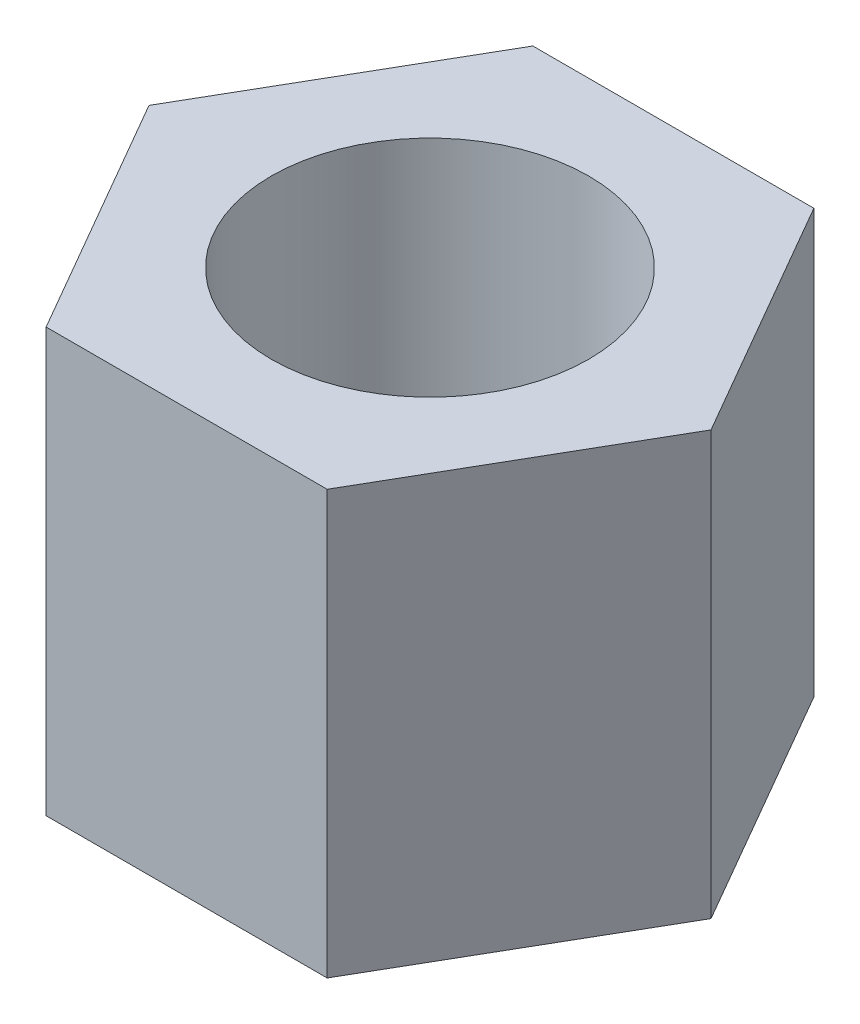
ISO-10303-21;
HEADER;
FILE_DESCRIPTION(('STEP AP214'),'2;1');
FILE_NAME('part.step','',(''),(''),'','','');
FILE_SCHEMA(('AUTOMOTIVE_DESIGN { 1 0 10303 214 1 1 1 1 }'));
ENDSEC;
DATA;
#1=APPLICATION_CONTEXT('core data for automotive mechanical design processes');
#2=APPLICATION_PROTOCOL_DEFINITION('international standard','automotive_design',2000,#1);
#3=PRODUCT_CONTEXT('',#1,'mechanical');
#4=PRODUCT('Part','Part','',(#3));
#5=PRODUCT_RELATED_PRODUCT_CATEGORY('part','',(#4));
#6=PRODUCT_DEFINITION_FORMATION('','',#4);
#7=PRODUCT_DEFINITION_CONTEXT('part definition',#1,'design');
#8=PRODUCT_DEFINITION('design','',#6,#7);
#9=PRODUCT_DEFINITION_SHAPE('','',#8);
#10=(LENGTH_UNIT() NAMED_UNIT(*) SI_UNIT(.MILLI.,.METRE.));
#11=(NAMED_UNIT(*) PLANE_ANGLE_UNIT() SI_UNIT($,.RADIAN.));
#12=(NAMED_UNIT(*) SI_UNIT($,.STERADIAN.) SOLID_ANGLE_UNIT());
#13=UNCERTAINTY_MEASURE_WITH_UNIT(LENGTH_MEASURE(1.E-05),#10,'distance_accuracy_value','');
#14=(GEOMETRIC_REPRESENTATION_CONTEXT(3) GLOBAL_UNCERTAINTY_ASSIGNED_CONTEXT((#13)) GLOBAL_UNIT_ASSIGNED_CONTEXT((#10,
#11,#12)) REPRESENTATION_CONTEXT('',''));
#15=CARTESIAN_POINT('',(0.,0.,0.));
#16=DIRECTION('',(0.,0.,1.));
#17=DIRECTION('',(1.,0.,0.));
#18=AXIS2_PLACEMENT_3D('',#15,#16,#17);
#19=CARTESIAN_POINT('',(1.32790561913614,4.,-2.3));
#20=DIRECTION('',(0.,0.,1.));
#21=DIRECTION('',(1.,0.,0.));
#22=AXIS2_PLACEMENT_3D('',#19,#20,#21);
#23=PLANE('',#22);
#24=DIRECTION('',(-1.,0.,0.));
#25=VECTOR('',#24,1.);
#26=CARTESIAN_POINT('',(1.32790561913614,0.,-2.3));
#27=LINE('',#26,#25);
#28=CARTESIAN_POINT('',(1.32790561913614,0.,-2.3));
#29=VERTEX_POINT('',#28);
#30=CARTESIAN_POINT('',(-1.32790561913614,0.,-2.3));
#31=VERTEX_POINT('',#30);
#32=EDGE_CURVE('E131',#29,#31,#27,.T.);
#33=ORIENTED_EDGE('',*,*,#32,.T.);
#34=DIRECTION('',(0.,-1.,0.));
#35=VECTOR('',#34,1.);
#36=CARTESIAN_POINT('',(-1.32790561913614,4.,-2.3));
#37=LINE('',#36,#35);
#38=CARTESIAN_POINT('',(-1.32790561913614,4.,-2.3));
#39=VERTEX_POINT('',#38);
#40=EDGE_CURVE('E11',#39,#31,#37,.T.);
#41=ORIENTED_EDGE('',*,*,#40,.F.);
#42=DIRECTION('',(-1.,0.,0.));
#43=VECTOR('',#42,1.);
#44=CARTESIAN_POINT('',(1.32790561913614,4.,-2.3));
#45=LINE('',#44,#43);
#46=CARTESIAN_POINT('',(1.32790561913614,4.,-2.3));
#47=VERTEX_POINT('',#46);
#48=EDGE_CURVE('E142',#47,#39,#45,.T.);
#49=ORIENTED_EDGE('',*,*,#48,.F.);
#50=DIRECTION('',(0.,-1.,0.));
#51=VECTOR('',#50,1.);
#52=CARTESIAN_POINT('',(1.32790561913614,4.,-2.3));
#53=LINE('',#52,#51);
#54=EDGE_CURVE('E127',#47,#29,#53,.T.);
#55=ORIENTED_EDGE('',*,*,#54,.T.);
#56=EDGE_LOOP('',(#33,#41,#49,#55));
#57=FACE_BOUND('',#56,.T.);
#58=ADVANCED_FACE('F47',(#57),#23,.F.);
#59=CARTESIAN_POINT('',(-1.32790561913614,4.,-2.3));
#60=DIRECTION('',(0.866025403784439,0.,0.499999999999999));
#61=DIRECTION('',(0.499999999999999,0.,-0.866025403784439));
#62=AXIS2_PLACEMENT_3D('',#59,#60,#61);
#63=PLANE('',#62);
#64=DIRECTION('',(-0.5,0.,0.866025403784439));
#65=VECTOR('',#64,1.);
#66=CARTESIAN_POINT('',(-1.32790561913614,0.,-2.3));
#67=LINE('',#66,#65);
#68=CARTESIAN_POINT('',(-2.65581123827228,0.,0.));
#69=VERTEX_POINT('',#68);
#70=EDGE_CURVE('E134',#31,#69,#67,.T.);
#71=ORIENTED_EDGE('',*,*,#70,.T.);
#72=DIRECTION('',(0.,-1.,0.));
#73=VECTOR('',#72,1.);
#74=CARTESIAN_POINT('',(-2.65581123827228,4.,0.));
#75=LINE('',#74,#73);
#76=CARTESIAN_POINT('',(-2.65581123827228,4.,0.));
#77=VERTEX_POINT('',#76);
#78=EDGE_CURVE('E55',#77,#69,#75,.T.);
#79=ORIENTED_EDGE('',*,*,#78,.F.);
#80=DIRECTION('',(-0.5,0.,0.866025403784439));
#81=VECTOR('',#80,1.);
#82=CARTESIAN_POINT('',(-1.32790561913614,4.,-2.3));
#83=LINE('',#82,#81);
#84=EDGE_CURVE('E100',#39,#77,#83,.T.);
#85=ORIENTED_EDGE('',*,*,#84,.F.);
#86=ORIENTED_EDGE('',*,*,#40,.T.);
#87=EDGE_LOOP('',(#71,#79,#85,#86));
#88=FACE_BOUND('',#87,.T.);
#89=ADVANCED_FACE('F167',(#88),#63,.F.);
#90=CARTESIAN_POINT('',(-2.65581123827228,4.,0.));
#91=DIRECTION('',(0.866025403784438,0.,-0.5));
#92=DIRECTION('',(-0.5,0.,-0.866025403784439));
#93=AXIS2_PLACEMENT_3D('',#90,#91,#92);
#94=PLANE('',#93);
#95=DIRECTION('',(0.5,0.,0.866025403784438));
#96=VECTOR('',#95,1.);
#97=CARTESIAN_POINT('',(-2.65581123827228,0.,0.));
#98=LINE('',#97,#96);
#99=CARTESIAN_POINT('',(-1.32790561913614,0.,2.3));
#100=VERTEX_POINT('',#99);
#101=EDGE_CURVE('E137',#69,#100,#98,.T.);
#102=ORIENTED_EDGE('',*,*,#101,.T.);
#103=DIRECTION('',(0.,-1.,0.));
#104=VECTOR('',#103,1.);
#105=CARTESIAN_POINT('',(-1.32790561913614,4.,2.3));
#106=LINE('',#105,#104);
#107=CARTESIAN_POINT('',(-1.32790561913614,4.,2.3));
#108=VERTEX_POINT('',#107);
#109=EDGE_CURVE('E122',#108,#100,#106,.T.);
#110=ORIENTED_EDGE('',*,*,#109,.F.);
#111=DIRECTION('',(0.5,0.,0.866025403784438));
#112=VECTOR('',#111,1.);
#113=CARTESIAN_POINT('',(-2.65581123827228,4.,0.));
#114=LINE('',#113,#112);
#115=EDGE_CURVE('E113',#77,#108,#114,.T.);
#116=ORIENTED_EDGE('',*,*,#115,.F.);
#117=ORIENTED_EDGE('',*,*,#78,.T.);
#118=EDGE_LOOP('',(#102,#110,#116,#117));
#119=FACE_BOUND('',#118,.T.);
#120=ADVANCED_FACE('F148',(#119),#94,.F.);
#121=CARTESIAN_POINT('',(-1.32790561913614,4.,2.3));
#122=DIRECTION('',(0.,0.,-1.));
#123=DIRECTION('',(-1.,0.,0.));
#124=AXIS2_PLACEMENT_3D('',#121,#122,#123);
#125=PLANE('',#124);
#126=DIRECTION('',(1.,0.,0.));
#127=VECTOR('',#126,1.);
#128=CARTESIAN_POINT('',(-1.32790561913614,0.,2.3));
#129=LINE('',#128,#127);
#130=CARTESIAN_POINT('',(1.32790561913614,0.,2.3));
#131=VERTEX_POINT('',#130);
#132=EDGE_CURVE('E121',#100,#131,#129,.T.);
#133=ORIENTED_EDGE('',*,*,#132,.T.);
#134=DIRECTION('',(0.,-1.,0.));
#135=VECTOR('',#134,1.);
#136=CARTESIAN_POINT('',(1.32790561913614,4.,2.3));
#137=LINE('',#136,#135);
#138=CARTESIAN_POINT('',(1.32790561913614,4.,2.3));
#139=VERTEX_POINT('',#138);
#140=EDGE_CURVE('E118',#139,#131,#137,.T.);
#141=ORIENTED_EDGE('',*,*,#140,.F.);
#142=DIRECTION('',(1.,0.,0.));
#143=VECTOR('',#142,1.);
#144=CARTESIAN_POINT('',(-1.32790561913614,4.,2.3));
#145=LINE('',#144,#143);
#146=EDGE_CURVE('E107',#108,#139,#145,.T.);
#147=ORIENTED_EDGE('',*,*,#146,.F.);
#148=ORIENTED_EDGE('',*,*,#109,.T.);
#149=EDGE_LOOP('',(#133,#141,#147,#148));
#150=FACE_BOUND('',#149,.T.);
#151=ADVANCED_FACE('F119',(#150),#125,.F.);
#152=CARTESIAN_POINT('',(1.32790561913614,4.,2.3));
#153=DIRECTION('',(-0.866025403784439,0.,-0.5));
#154=DIRECTION('',(-0.5,0.,0.866025403784439));
#155=AXIS2_PLACEMENT_3D('',#152,#153,#154);
#156=PLANE('',#155);
#157=DIRECTION('',(0.5,0.,-0.866025403784439));
#158=VECTOR('',#157,1.);
#159=CARTESIAN_POINT('',(1.32790561913614,0.,2.3));
#160=LINE('',#159,#158);
#161=CARTESIAN_POINT('',(2.65581123827228,0.,0.));
#162=VERTEX_POINT('',#161);
#163=EDGE_CURVE('E86',#131,#162,#160,.T.);
#164=ORIENTED_EDGE('',*,*,#163,.T.);
#165=DIRECTION('',(0.,-1.,0.));
#166=VECTOR('',#165,1.);
#167=CARTESIAN_POINT('',(2.65581123827228,4.,0.));
#168=LINE('',#167,#166);
#169=CARTESIAN_POINT('',(2.65581123827228,4.,0.));
#170=VERTEX_POINT('',#169);
#171=EDGE_CURVE('E123',#170,#162,#168,.T.);
#172=ORIENTED_EDGE('',*,*,#171,.F.);
#173=DIRECTION('',(0.5,0.,-0.866025403784439));
#174=VECTOR('',#173,1.);
#175=CARTESIAN_POINT('',(1.32790561913614,4.,2.3));
#176=LINE('',#175,#174);
#177=EDGE_CURVE('E111',#139,#170,#176,.T.);
#178=ORIENTED_EDGE('',*,*,#177,.F.);
#179=ORIENTED_EDGE('',*,*,#140,.T.);
#180=EDGE_LOOP('',(#164,#172,#178,#179));
#181=FACE_BOUND('',#180,.T.);
#182=ADVANCED_FACE('F125',(#181),#156,.F.);
#183=CARTESIAN_POINT('',(2.65581123827228,4.,0.));
#184=DIRECTION('',(-0.866025403784438,0.,0.5));
#185=DIRECTION('',(0.5,0.,0.866025403784438));
#186=AXIS2_PLACEMENT_3D('',#183,#184,#185);
#187=PLANE('',#186);
#188=DIRECTION('',(-0.5,0.,-0.866025403784438));
#189=VECTOR('',#188,1.);
#190=CARTESIAN_POINT('',(2.65581123827228,0.,0.));
#191=LINE('',#190,#189);
#192=EDGE_CURVE('E92',#162,#29,#191,.T.);
#193=ORIENTED_EDGE('',*,*,#192,.T.);
#194=ORIENTED_EDGE('',*,*,#54,.F.);
#195=DIRECTION('',(-0.5,0.,-0.866025403784438));
#196=VECTOR('',#195,1.);
#197=CARTESIAN_POINT('',(2.65581123827228,4.,0.));
#198=LINE('',#197,#196);
#199=EDGE_CURVE('E63',#170,#47,#198,.T.);
#200=ORIENTED_EDGE('',*,*,#199,.F.);
#201=ORIENTED_EDGE('',*,*,#171,.T.);
#202=EDGE_LOOP('',(#193,#194,#200,#201));
#203=FACE_BOUND('',#202,.T.);
#204=ADVANCED_FACE('F155',(#203),#187,.F.);
#205=CARTESIAN_POINT('',(0.,4.,0.));
#206=DIRECTION('',(0.,1.,0.));
#207=DIRECTION('',(0.,0.,1.));
#208=AXIS2_PLACEMENT_3D('',#205,#206,#207);
#209=PLANE('',#208);
#210=CARTESIAN_POINT('',(0.,4.,0.));
#211=DIRECTION('',(0.,1.,0.));
#212=DIRECTION('',(0.,0.,1.));
#213=AXIS2_PLACEMENT_3D('',#210,#211,#212);
#214=CIRCLE('',#213,1.5);
#215=CARTESIAN_POINT('',(0.,4.,1.5));
#216=VERTEX_POINT('',#215);
#217=EDGE_CURVE('E135',#216,#216,#214,.F.);
#218=ORIENTED_EDGE('',*,*,#217,.T.);
#219=EDGE_LOOP('',(#218));
#220=FACE_BOUND('',#219,.T.);
#221=ORIENTED_EDGE('',*,*,#48,.T.);
#222=ORIENTED_EDGE('',*,*,#84,.T.);
#223=ORIENTED_EDGE('',*,*,#115,.T.);
#224=ORIENTED_EDGE('',*,*,#146,.T.);
#225=ORIENTED_EDGE('',*,*,#177,.T.);
#226=ORIENTED_EDGE('',*,*,#199,.T.);
#227=EDGE_LOOP('',(#221,#222,#223,#224,#225,#226));
#228=FACE_BOUND('',#227,.T.);
#229=ADVANCED_FACE('F109',(#220,#228),#209,.T.);
#230=CARTESIAN_POINT('',(0.,0.,0.));
#231=DIRECTION('',(0.,1.,0.));
#232=DIRECTION('',(0.,0.,1.));
#233=AXIS2_PLACEMENT_3D('',#230,#231,#232);
#234=PLANE('',#233);
#235=CARTESIAN_POINT('',(0.,0.,0.));
#236=DIRECTION('',(0.,-1.,0.));
#237=DIRECTION('',(0.,0.,-1.));
#238=AXIS2_PLACEMENT_3D('',#235,#236,#237);
#239=CIRCLE('',#238,1.5);
#240=CARTESIAN_POINT('',(0.,0.,-1.5));
#241=VERTEX_POINT('',#240);
#242=EDGE_CURVE('E247',#241,#241,#239,.T.);
#243=ORIENTED_EDGE('',*,*,#242,.F.);
#244=EDGE_LOOP('',(#243));
#245=FACE_BOUND('',#244,.T.);
#246=ORIENTED_EDGE('',*,*,#32,.F.);
#247=ORIENTED_EDGE('',*,*,#192,.F.);
#248=ORIENTED_EDGE('',*,*,#163,.F.);
#249=ORIENTED_EDGE('',*,*,#132,.F.);
#250=ORIENTED_EDGE('',*,*,#101,.F.);
#251=ORIENTED_EDGE('',*,*,#70,.F.);
#252=EDGE_LOOP('',(#246,#247,#248,#249,#250,#251));
#253=FACE_BOUND('',#252,.T.);
#254=ADVANCED_FACE('F151',(#245,#253),#234,.F.);
#255=CARTESIAN_POINT('',(0.,8.24264068711929,0.));
#256=DIRECTION('',(0.,-1.,0.));
#257=DIRECTION('',(0.,0.,-1.));
#258=AXIS2_PLACEMENT_3D('',#255,#256,#257);
#259=CYLINDRICAL_SURFACE('',#258,1.5);
#260=ORIENTED_EDGE('',*,*,#242,.T.);
#261=EDGE_LOOP('',(#260));
#262=FACE_BOUND('',#261,.T.);
#263=ORIENTED_EDGE('',*,*,#217,.F.);
#264=EDGE_LOOP('',(#263));
#265=FACE_BOUND('',#264,.T.);
#266=ADVANCED_FACE('F207',(#262,#265),#259,.F.);
#267=CLOSED_SHELL('',(#58,#89,#120,#151,#182,#204,#229,#254,#266));
#268=MANIFOLD_SOLID_BREP('B2',#267);
#269=ADVANCED_BREP_SHAPE_REPRESENTATION('',(#18,#268),#14);
#270=SHAPE_DEFINITION_REPRESENTATION(#9,#269);
ENDSEC;
END-ISO-10303-21;
